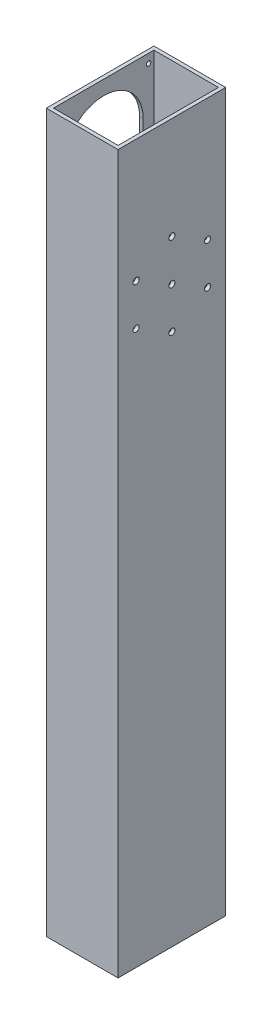
ISO-10303-21;
HEADER;
FILE_DESCRIPTION(('STEP AP214'),'2;1');
FILE_NAME('part.step','',(''),(''),'','','');
FILE_SCHEMA(('AUTOMOTIVE_DESIGN { 1 0 10303 214 1 1 1 1 }'));
ENDSEC;
DATA;
#1=APPLICATION_CONTEXT('core data for automotive mechanical design processes');
#2=APPLICATION_PROTOCOL_DEFINITION('international standard','automotive_design',2000,#1);
#3=PRODUCT_CONTEXT('',#1,'mechanical');
#4=PRODUCT('Part','Part','',(#3));
#5=PRODUCT_RELATED_PRODUCT_CATEGORY('part','',(#4));
#6=PRODUCT_DEFINITION_FORMATION('','',#4);
#7=PRODUCT_DEFINITION_CONTEXT('part definition',#1,'design');
#8=PRODUCT_DEFINITION('design','',#6,#7);
#9=PRODUCT_DEFINITION_SHAPE('','',#8);
#10=(LENGTH_UNIT() NAMED_UNIT(*) SI_UNIT(.MILLI.,.METRE.));
#11=(NAMED_UNIT(*) PLANE_ANGLE_UNIT() SI_UNIT($,.RADIAN.));
#12=(NAMED_UNIT(*) SI_UNIT($,.STERADIAN.) SOLID_ANGLE_UNIT());
#13=UNCERTAINTY_MEASURE_WITH_UNIT(LENGTH_MEASURE(1.E-05),#10,'distance_accuracy_value','');
#14=(GEOMETRIC_REPRESENTATION_CONTEXT(3) GLOBAL_UNCERTAINTY_ASSIGNED_CONTEXT((#13)) GLOBAL_UNIT_ASSIGNED_CONTEXT((#10,
#11,#12)) REPRESENTATION_CONTEXT('',''));
#15=CARTESIAN_POINT('',(0.,0.,0.));
#16=DIRECTION('',(0.,0.,1.));
#17=DIRECTION('',(1.,0.,0.));
#18=AXIS2_PLACEMENT_3D('',#15,#16,#17);
#19=CARTESIAN_POINT('',(0.,400.,0.));
#20=DIRECTION('',(1.,0.,0.));
#21=DIRECTION('',(0.,0.,-1.));
#22=AXIS2_PLACEMENT_3D('',#19,#20,#21);
#23=PLANE('',#22);
#24=CARTESIAN_POINT('',(0.,245.,-5.00000000000005));
#25=DIRECTION('',(-1.,0.,0.));
#26=DIRECTION('',(0.,0.,1.));
#27=AXIS2_PLACEMENT_3D('',#24,#25,#26);
#28=CIRCLE('',#27,1.5);
#29=CARTESIAN_POINT('',(0.,245.,-3.50000000000004));
#30=VERTEX_POINT('',#29);
#31=EDGE_CURVE('E331',#30,#30,#28,.T.);
#32=ORIENTED_EDGE('',*,*,#31,.F.);
#33=EDGE_LOOP('',(#32));
#34=FACE_BOUND('',#33,.T.);
#35=DIRECTION('',(0.,1.,0.));
#36=VECTOR('',#35,1.);
#37=CARTESIAN_POINT('',(0.,270.,-8.));
#38=LINE('',#37,#36);
#39=CARTESIAN_POINT('',(0.,270.,-8.));
#40=VERTEX_POINT('',#39);
#41=CARTESIAN_POINT('',(0.,370.,-8.00000000000002));
#42=VERTEX_POINT('',#41);
#43=EDGE_CURVE('E145',#40,#42,#38,.T.);
#44=ORIENTED_EDGE('',*,*,#43,.F.);
#45=CARTESIAN_POINT('',(0.,270.,-30.));
#46=DIRECTION('',(-1.,0.,0.));
#47=DIRECTION('',(0.,0.,1.));
#48=AXIS2_PLACEMENT_3D('',#45,#46,#47);
#49=CIRCLE('',#48,22.);
#50=CARTESIAN_POINT('',(0.,270.,-52.));
#51=VERTEX_POINT('',#50);
#52=EDGE_CURVE('E59',#51,#40,#49,.T.);
#53=ORIENTED_EDGE('',*,*,#52,.F.);
#54=DIRECTION('',(0.,-1.,0.));
#55=VECTOR('',#54,1.);
#56=CARTESIAN_POINT('',(0.,270.,-52.));
#57=LINE('',#56,#55);
#58=CARTESIAN_POINT('',(0.,370.,-52.));
#59=VERTEX_POINT('',#58);
#60=EDGE_CURVE('E152',#59,#51,#57,.T.);
#61=ORIENTED_EDGE('',*,*,#60,.F.);
#62=CARTESIAN_POINT('',(0.,370.,-30.));
#63=DIRECTION('',(-1.,0.,0.));
#64=DIRECTION('',(0.,0.,1.));
#65=AXIS2_PLACEMENT_3D('',#62,#63,#64);
#66=CIRCLE('',#65,22.);
#67=EDGE_CURVE('E135',#42,#59,#66,.T.);
#68=ORIENTED_EDGE('',*,*,#67,.F.);
#69=EDGE_LOOP('',(#44,#53,#61,#68));
#70=FACE_BOUND('',#69,.T.);
#71=DIRECTION('',(0.,0.,1.));
#72=VECTOR('',#71,1.);
#73=CARTESIAN_POINT('',(0.,0.,0.));
#74=LINE('',#73,#72);
#75=CARTESIAN_POINT('',(0.,0.,-60.));
#76=VERTEX_POINT('',#75);
#77=CARTESIAN_POINT('',(0.,0.,0.));
#78=VERTEX_POINT('',#77);
#79=EDGE_CURVE('E262',#76,#78,#74,.T.);
#80=ORIENTED_EDGE('',*,*,#79,.T.);
#81=DIRECTION('',(0.,-1.,0.));
#82=VECTOR('',#81,1.);
#83=CARTESIAN_POINT('',(0.,400.,0.));
#84=LINE('',#83,#82);
#85=CARTESIAN_POINT('',(0.,400.,0.));
#86=VERTEX_POINT('',#85);
#87=EDGE_CURVE('E300',#86,#78,#84,.T.);
#88=ORIENTED_EDGE('',*,*,#87,.F.);
#89=DIRECTION('',(0.,0.,1.));
#90=VECTOR('',#89,1.);
#91=CARTESIAN_POINT('',(0.,400.,0.));
#92=LINE('',#91,#90);
#93=CARTESIAN_POINT('',(0.,400.,-60.));
#94=VERTEX_POINT('',#93);
#95=EDGE_CURVE('E263',#94,#86,#92,.T.);
#96=ORIENTED_EDGE('',*,*,#95,.F.);
#97=DIRECTION('',(0.,-1.,0.));
#98=VECTOR('',#97,1.);
#99=CARTESIAN_POINT('',(0.,400.,-60.));
#100=LINE('',#99,#98);
#101=EDGE_CURVE('E277',#94,#76,#100,.T.);
#102=ORIENTED_EDGE('',*,*,#101,.T.);
#103=EDGE_LOOP('',(#80,#88,#96,#102));
#104=FACE_BOUND('',#103,.T.);
#105=CARTESIAN_POINT('',(0.,295.,-5.00000000000004));
#106=DIRECTION('',(-1.,0.,0.));
#107=DIRECTION('',(0.,0.,1.));
#108=AXIS2_PLACEMENT_3D('',#105,#106,#107);
#109=CIRCLE('',#108,1.5);
#110=CARTESIAN_POINT('',(0.,295.,-3.50000000000004));
#111=VERTEX_POINT('',#110);
#112=EDGE_CURVE('E343',#111,#111,#109,.T.);
#113=ORIENTED_EDGE('',*,*,#112,.F.);
#114=EDGE_LOOP('',(#113));
#115=FACE_BOUND('',#114,.T.);
#116=CARTESIAN_POINT('',(0.,345.,-5.00000000000003));
#117=DIRECTION('',(-1.,0.,0.));
#118=DIRECTION('',(0.,0.,1.));
#119=AXIS2_PLACEMENT_3D('',#116,#117,#118);
#120=CIRCLE('',#119,1.5);
#121=CARTESIAN_POINT('',(0.,345.,-3.50000000000003));
#122=VERTEX_POINT('',#121);
#123=EDGE_CURVE('E355',#122,#122,#120,.T.);
#124=ORIENTED_EDGE('',*,*,#123,.F.);
#125=EDGE_LOOP('',(#124));
#126=FACE_BOUND('',#125,.T.);
#127=CARTESIAN_POINT('',(0.,395.,-5.00000000000002));
#128=DIRECTION('',(-1.,0.,0.));
#129=DIRECTION('',(0.,0.,1.));
#130=AXIS2_PLACEMENT_3D('',#127,#128,#129);
#131=CIRCLE('',#130,1.5);
#132=CARTESIAN_POINT('',(0.,395.,-3.50000000000002));
#133=VERTEX_POINT('',#132);
#134=EDGE_CURVE('E367',#133,#133,#131,.T.);
#135=ORIENTED_EDGE('',*,*,#134,.F.);
#136=EDGE_LOOP('',(#135));
#137=FACE_BOUND('',#136,.T.);
#138=CARTESIAN_POINT('',(0.,295.,-55.));
#139=DIRECTION('',(-1.,0.,0.));
#140=DIRECTION('',(0.,0.,1.));
#141=AXIS2_PLACEMENT_3D('',#138,#139,#140);
#142=CIRCLE('',#141,1.5);
#143=CARTESIAN_POINT('',(0.,295.,-53.5));
#144=VERTEX_POINT('',#143);
#145=EDGE_CURVE('E379',#144,#144,#142,.T.);
#146=ORIENTED_EDGE('',*,*,#145,.F.);
#147=EDGE_LOOP('',(#146));
#148=FACE_BOUND('',#147,.T.);
#149=CARTESIAN_POINT('',(0.,345.,-55.));
#150=DIRECTION('',(-1.,0.,0.));
#151=DIRECTION('',(0.,0.,1.));
#152=AXIS2_PLACEMENT_3D('',#149,#150,#151);
#153=CIRCLE('',#152,1.5);
#154=CARTESIAN_POINT('',(0.,345.,-53.5));
#155=VERTEX_POINT('',#154);
#156=EDGE_CURVE('E391',#155,#155,#153,.T.);
#157=ORIENTED_EDGE('',*,*,#156,.F.);
#158=EDGE_LOOP('',(#157));
#159=FACE_BOUND('',#158,.T.);
#160=CARTESIAN_POINT('',(0.,245.,-55.));
#161=DIRECTION('',(-1.,0.,0.));
#162=DIRECTION('',(0.,0.,1.));
#163=AXIS2_PLACEMENT_3D('',#160,#161,#162);
#164=CIRCLE('',#163,1.5);
#165=CARTESIAN_POINT('',(0.,245.,-53.5));
#166=VERTEX_POINT('',#165);
#167=EDGE_CURVE('E403',#166,#166,#164,.T.);
#168=ORIENTED_EDGE('',*,*,#167,.F.);
#169=EDGE_LOOP('',(#168));
#170=FACE_BOUND('',#169,.T.);
#171=CARTESIAN_POINT('',(0.,395.,-55.));
#172=DIRECTION('',(-1.,0.,0.));
#173=DIRECTION('',(0.,0.,1.));
#174=AXIS2_PLACEMENT_3D('',#171,#172,#173);
#175=CIRCLE('',#174,1.5);
#176=CARTESIAN_POINT('',(0.,395.,-53.5));
#177=VERTEX_POINT('',#176);
#178=EDGE_CURVE('E415',#177,#177,#175,.T.);
#179=ORIENTED_EDGE('',*,*,#178,.F.);
#180=EDGE_LOOP('',(#179));
#181=FACE_BOUND('',#180,.T.);
#182=ADVANCED_FACE('F44',(#34,#70,#104,#115,#126,#137,#148,#159,#170,#181),#23,.F.);
#183=CARTESIAN_POINT('',(0.,400.,0.));
#184=DIRECTION('',(0.,-1.,0.));
#185=DIRECTION('',(0.,0.,-1.));
#186=AXIS2_PLACEMENT_3D('',#183,#184,#185);
#187=PLANE('',#186);
#188=ORIENTED_EDGE('',*,*,#95,.T.);
#189=DIRECTION('',(1.,0.,0.));
#190=VECTOR('',#189,1.);
#191=CARTESIAN_POINT('',(0.,400.,0.));
#192=LINE('',#191,#190);
#193=CARTESIAN_POINT('',(40.,400.,0.));
#194=VERTEX_POINT('',#193);
#195=EDGE_CURVE('E267',#86,#194,#192,.T.);
#196=ORIENTED_EDGE('',*,*,#195,.T.);
#197=DIRECTION('',(0.,0.,-1.));
#198=VECTOR('',#197,1.);
#199=CARTESIAN_POINT('',(40.,400.,0.));
#200=LINE('',#199,#198);
#201=CARTESIAN_POINT('',(40.,400.,-60.));
#202=VERTEX_POINT('',#201);
#203=EDGE_CURVE('E271',#194,#202,#200,.T.);
#204=ORIENTED_EDGE('',*,*,#203,.T.);
#205=DIRECTION('',(-1.,0.,0.));
#206=VECTOR('',#205,1.);
#207=CARTESIAN_POINT('',(0.,400.,-60.));
#208=LINE('',#207,#206);
#209=EDGE_CURVE('E274',#202,#94,#208,.T.);
#210=ORIENTED_EDGE('',*,*,#209,.T.);
#211=EDGE_LOOP('',(#188,#196,#204,#210));
#212=FACE_BOUND('',#211,.T.);
#213=DIRECTION('',(1.,0.,0.));
#214=VECTOR('',#213,1.);
#215=CARTESIAN_POINT('',(2.,400.,-2.));
#216=LINE('',#215,#214);
#217=CARTESIAN_POINT('',(2.,400.,-2.));
#218=VERTEX_POINT('',#217);
#219=CARTESIAN_POINT('',(38.,400.,-2.));
#220=VERTEX_POINT('',#219);
#221=EDGE_CURVE('E219',#218,#220,#216,.T.);
#222=ORIENTED_EDGE('',*,*,#221,.F.);
#223=DIRECTION('',(0.,0.,1.));
#224=VECTOR('',#223,1.);
#225=CARTESIAN_POINT('',(2.,400.,-2.));
#226=LINE('',#225,#224);
#227=CARTESIAN_POINT('',(2.,400.,-58.));
#228=VERTEX_POINT('',#227);
#229=EDGE_CURVE('E230',#228,#218,#226,.T.);
#230=ORIENTED_EDGE('',*,*,#229,.F.);
#231=DIRECTION('',(-1.,0.,0.));
#232=VECTOR('',#231,1.);
#233=CARTESIAN_POINT('',(2.,400.,-58.));
#234=LINE('',#233,#232);
#235=CARTESIAN_POINT('',(38.,400.,-58.));
#236=VERTEX_POINT('',#235);
#237=EDGE_CURVE('E226',#236,#228,#234,.T.);
#238=ORIENTED_EDGE('',*,*,#237,.F.);
#239=DIRECTION('',(0.,0.,-1.));
#240=VECTOR('',#239,1.);
#241=CARTESIAN_POINT('',(38.,400.,-2.));
#242=LINE('',#241,#240);
#243=EDGE_CURVE('E222',#220,#236,#242,.T.);
#244=ORIENTED_EDGE('',*,*,#243,.F.);
#245=EDGE_LOOP('',(#222,#230,#238,#244));
#246=FACE_BOUND('',#245,.T.);
#247=ADVANCED_FACE('F423',(#212,#246),#187,.F.);
#248=CARTESIAN_POINT('',(0.,0.,0.));
#249=DIRECTION('',(0.,-1.,0.));
#250=DIRECTION('',(0.,0.,-1.));
#251=AXIS2_PLACEMENT_3D('',#248,#249,#250);
#252=PLANE('',#251);
#253=ORIENTED_EDGE('',*,*,#79,.F.);
#254=DIRECTION('',(-1.,0.,0.));
#255=VECTOR('',#254,1.);
#256=CARTESIAN_POINT('',(0.,0.,-60.));
#257=LINE('',#256,#255);
#258=CARTESIAN_POINT('',(40.,0.,-60.));
#259=VERTEX_POINT('',#258);
#260=EDGE_CURVE('E268',#259,#76,#257,.T.);
#261=ORIENTED_EDGE('',*,*,#260,.F.);
#262=DIRECTION('',(0.,0.,-1.));
#263=VECTOR('',#262,1.);
#264=CARTESIAN_POINT('',(40.,0.,0.));
#265=LINE('',#264,#263);
#266=CARTESIAN_POINT('',(40.,0.,0.));
#267=VERTEX_POINT('',#266);
#268=EDGE_CURVE('E284',#267,#259,#265,.T.);
#269=ORIENTED_EDGE('',*,*,#268,.F.);
#270=DIRECTION('',(1.,0.,0.));
#271=VECTOR('',#270,1.);
#272=CARTESIAN_POINT('',(0.,0.,0.));
#273=LINE('',#272,#271);
#274=EDGE_CURVE('E281',#78,#267,#273,.T.);
#275=ORIENTED_EDGE('',*,*,#274,.F.);
#276=EDGE_LOOP('',(#253,#261,#269,#275));
#277=FACE_BOUND('',#276,.T.);
#278=DIRECTION('',(0.,0.,1.));
#279=VECTOR('',#278,1.);
#280=CARTESIAN_POINT('',(2.,0.,-2.));
#281=LINE('',#280,#279);
#282=CARTESIAN_POINT('',(2.,0.,-58.));
#283=VERTEX_POINT('',#282);
#284=CARTESIAN_POINT('',(2.,0.,-2.));
#285=VERTEX_POINT('',#284);
#286=EDGE_CURVE('E223',#283,#285,#281,.T.);
#287=ORIENTED_EDGE('',*,*,#286,.T.);
#288=DIRECTION('',(1.,0.,0.));
#289=VECTOR('',#288,1.);
#290=CARTESIAN_POINT('',(2.,0.,-2.));
#291=LINE('',#290,#289);
#292=CARTESIAN_POINT('',(38.,0.,-2.));
#293=VERTEX_POINT('',#292);
#294=EDGE_CURVE('E234',#285,#293,#291,.T.);
#295=ORIENTED_EDGE('',*,*,#294,.T.);
#296=DIRECTION('',(0.,0.,-1.));
#297=VECTOR('',#296,1.);
#298=CARTESIAN_POINT('',(38.,0.,-2.));
#299=LINE('',#298,#297);
#300=CARTESIAN_POINT('',(38.,0.,-58.));
#301=VERTEX_POINT('',#300);
#302=EDGE_CURVE('E238',#293,#301,#299,.T.);
#303=ORIENTED_EDGE('',*,*,#302,.T.);
#304=DIRECTION('',(-1.,0.,0.));
#305=VECTOR('',#304,1.);
#306=CARTESIAN_POINT('',(2.,0.,-58.));
#307=LINE('',#306,#305);
#308=EDGE_CURVE('E242',#301,#283,#307,.T.);
#309=ORIENTED_EDGE('',*,*,#308,.T.);
#310=EDGE_LOOP('',(#287,#295,#303,#309));
#311=FACE_BOUND('',#310,.T.);
#312=ADVANCED_FACE('F430',(#277,#311),#252,.T.);
#313=CARTESIAN_POINT('',(0.,400.,0.));
#314=DIRECTION('',(0.,0.,-1.));
#315=DIRECTION('',(-1.,0.,0.));
#316=AXIS2_PLACEMENT_3D('',#313,#314,#315);
#317=PLANE('',#316);
#318=ORIENTED_EDGE('',*,*,#274,.T.);
#319=DIRECTION('',(0.,-1.,0.));
#320=VECTOR('',#319,1.);
#321=CARTESIAN_POINT('',(40.,400.,0.));
#322=LINE('',#321,#320);
#323=EDGE_CURVE('E296',#194,#267,#322,.T.);
#324=ORIENTED_EDGE('',*,*,#323,.F.);
#325=ORIENTED_EDGE('',*,*,#195,.F.);
#326=ORIENTED_EDGE('',*,*,#87,.T.);
#327=EDGE_LOOP('',(#318,#324,#325,#326));
#328=FACE_BOUND('',#327,.T.);
#329=ADVANCED_FACE('F505',(#328),#317,.F.);
#330=CARTESIAN_POINT('',(40.,400.,0.));
#331=DIRECTION('',(-1.,0.,0.));
#332=DIRECTION('',(0.,0.,1.));
#333=AXIS2_PLACEMENT_3D('',#330,#331,#332);
#334=PLANE('',#333);
#335=CARTESIAN_POINT('',(40.,343.,-30.));
#336=DIRECTION('',(1.,0.,0.));
#337=DIRECTION('',(0.,0.,-1.));
#338=AXIS2_PLACEMENT_3D('',#335,#336,#337);
#339=CIRCLE('',#338,1.69999999999998);
#340=CARTESIAN_POINT('',(40.,343.,-31.7));
#341=VERTEX_POINT('',#340);
#342=EDGE_CURVE('E162',#341,#341,#339,.T.);
#343=ORIENTED_EDGE('',*,*,#342,.F.);
#344=EDGE_LOOP('',(#343));
#345=FACE_BOUND('',#344,.T.);
#346=CARTESIAN_POINT('',(40.,331.5,-49.9185842870421));
#347=DIRECTION('',(1.,0.,0.));
#348=DIRECTION('',(0.,0.,-1.));
#349=AXIS2_PLACEMENT_3D('',#346,#347,#348);
#350=CIRCLE('',#349,1.69999999999998);
#351=CARTESIAN_POINT('',(40.,331.5,-51.6185842870421));
#352=VERTEX_POINT('',#351);
#353=EDGE_CURVE('E174',#352,#352,#350,.T.);
#354=ORIENTED_EDGE('',*,*,#353,.F.);
#355=EDGE_LOOP('',(#354));
#356=FACE_BOUND('',#355,.T.);
#357=CARTESIAN_POINT('',(40.,308.5,-49.9185842870421));
#358=DIRECTION('',(1.,0.,0.));
#359=DIRECTION('',(0.,0.,-1.));
#360=AXIS2_PLACEMENT_3D('',#357,#358,#359);
#361=CIRCLE('',#360,1.69999999999998);
#362=CARTESIAN_POINT('',(40.,308.5,-51.6185842870421));
#363=VERTEX_POINT('',#362);
#364=EDGE_CURVE('E182',#363,#363,#361,.T.);
#365=ORIENTED_EDGE('',*,*,#364,.F.);
#366=EDGE_LOOP('',(#365));
#367=FACE_BOUND('',#366,.T.);
#368=CARTESIAN_POINT('',(40.,297.,-30.));
#369=DIRECTION('',(1.,0.,0.));
#370=DIRECTION('',(0.,0.,-1.));
#371=AXIS2_PLACEMENT_3D('',#368,#369,#370);
#372=CIRCLE('',#371,1.69999999999998);
#373=CARTESIAN_POINT('',(40.,297.,-31.7));
#374=VERTEX_POINT('',#373);
#375=EDGE_CURVE('E190',#374,#374,#372,.T.);
#376=ORIENTED_EDGE('',*,*,#375,.F.);
#377=EDGE_LOOP('',(#376));
#378=FACE_BOUND('',#377,.T.);
#379=CARTESIAN_POINT('',(40.,308.5,-10.0814157129578));
#380=DIRECTION('',(1.,0.,0.));
#381=DIRECTION('',(0.,0.,-1.));
#382=AXIS2_PLACEMENT_3D('',#379,#380,#381);
#383=CIRCLE('',#382,1.69999999999998);
#384=CARTESIAN_POINT('',(40.,308.5,-11.7814157129578));
#385=VERTEX_POINT('',#384);
#386=EDGE_CURVE('E198',#385,#385,#383,.T.);
#387=ORIENTED_EDGE('',*,*,#386,.F.);
#388=EDGE_LOOP('',(#387));
#389=FACE_BOUND('',#388,.T.);
#390=CARTESIAN_POINT('',(40.,331.5,-10.0814157129579));
#391=DIRECTION('',(1.,0.,0.));
#392=DIRECTION('',(0.,0.,-1.));
#393=AXIS2_PLACEMENT_3D('',#390,#391,#392);
#394=CIRCLE('',#393,1.69999999999998);
#395=CARTESIAN_POINT('',(40.,331.5,-11.7814157129579));
#396=VERTEX_POINT('',#395);
#397=EDGE_CURVE('E206',#396,#396,#394,.T.);
#398=ORIENTED_EDGE('',*,*,#397,.F.);
#399=EDGE_LOOP('',(#398));
#400=FACE_BOUND('',#399,.T.);
#401=CARTESIAN_POINT('',(40.,320.,-30.));
#402=DIRECTION('',(1.,0.,0.));
#403=DIRECTION('',(0.,0.,-1.));
#404=AXIS2_PLACEMENT_3D('',#401,#402,#403);
#405=CIRCLE('',#404,1.69999999999998);
#406=CARTESIAN_POINT('',(40.,320.,-31.7));
#407=VERTEX_POINT('',#406);
#408=EDGE_CURVE('E214',#407,#407,#405,.T.);
#409=ORIENTED_EDGE('',*,*,#408,.F.);
#410=EDGE_LOOP('',(#409));
#411=FACE_BOUND('',#410,.T.);
#412=ORIENTED_EDGE('',*,*,#268,.T.);
#413=DIRECTION('',(0.,-1.,0.));
#414=VECTOR('',#413,1.);
#415=CARTESIAN_POINT('',(40.,400.,-60.));
#416=LINE('',#415,#414);
#417=EDGE_CURVE('E292',#202,#259,#416,.T.);
#418=ORIENTED_EDGE('',*,*,#417,.F.);
#419=ORIENTED_EDGE('',*,*,#203,.F.);
#420=ORIENTED_EDGE('',*,*,#323,.T.);
#421=EDGE_LOOP('',(#412,#418,#419,#420));
#422=FACE_BOUND('',#421,.T.);
#423=ADVANCED_FACE('F509',(#345,#356,#367,#378,#389,#400,#411,#422),#334,.F.);
#424=CARTESIAN_POINT('',(0.,400.,-60.));
#425=DIRECTION('',(0.,0.,1.));
#426=DIRECTION('',(1.,0.,0.));
#427=AXIS2_PLACEMENT_3D('',#424,#425,#426);
#428=PLANE('',#427);
#429=ORIENTED_EDGE('',*,*,#260,.T.);
#430=ORIENTED_EDGE('',*,*,#101,.F.);
#431=ORIENTED_EDGE('',*,*,#209,.F.);
#432=ORIENTED_EDGE('',*,*,#417,.T.);
#433=EDGE_LOOP('',(#429,#430,#431,#432));
#434=FACE_BOUND('',#433,.T.);
#435=ADVANCED_FACE('F500',(#434),#428,.F.);
#436=CARTESIAN_POINT('',(2.,400.,-2.));
#437=DIRECTION('',(0.,0.,-1.));
#438=DIRECTION('',(-1.,0.,0.));
#439=AXIS2_PLACEMENT_3D('',#436,#437,#438);
#440=PLANE('',#439);
#441=ORIENTED_EDGE('',*,*,#294,.F.);
#442=DIRECTION('',(0.,-1.,0.));
#443=VECTOR('',#442,1.);
#444=CARTESIAN_POINT('',(2.,400.,-2.));
#445=LINE('',#444,#443);
#446=EDGE_CURVE('E233',#218,#285,#445,.T.);
#447=ORIENTED_EDGE('',*,*,#446,.F.);
#448=ORIENTED_EDGE('',*,*,#221,.T.);
#449=DIRECTION('',(0.,-1.,0.));
#450=VECTOR('',#449,1.);
#451=CARTESIAN_POINT('',(38.,400.,-2.));
#452=LINE('',#451,#450);
#453=EDGE_CURVE('E258',#220,#293,#452,.T.);
#454=ORIENTED_EDGE('',*,*,#453,.T.);
#455=EDGE_LOOP('',(#441,#447,#448,#454));
#456=FACE_BOUND('',#455,.T.);
#457=ADVANCED_FACE('F497',(#456),#440,.T.);
#458=CARTESIAN_POINT('',(38.,400.,-2.));
#459=DIRECTION('',(-1.,0.,0.));
#460=DIRECTION('',(0.,0.,1.));
#461=AXIS2_PLACEMENT_3D('',#458,#459,#460);
#462=PLANE('',#461);
#463=CARTESIAN_POINT('',(38.,343.,-30.));
#464=DIRECTION('',(-1.,0.,0.));
#465=DIRECTION('',(0.,0.,1.));
#466=AXIS2_PLACEMENT_3D('',#463,#464,#465);
#467=CIRCLE('',#466,1.69999999999998);
#468=CARTESIAN_POINT('',(38.,343.,-28.3));
#469=VERTEX_POINT('',#468);
#470=EDGE_CURVE('E170',#469,#469,#467,.T.);
#471=ORIENTED_EDGE('',*,*,#470,.F.);
#472=EDGE_LOOP('',(#471));
#473=FACE_BOUND('',#472,.T.);
#474=CARTESIAN_POINT('',(38.,331.5,-49.9185842870421));
#475=DIRECTION('',(-1.,0.,0.));
#476=DIRECTION('',(0.,0.,1.));
#477=AXIS2_PLACEMENT_3D('',#474,#475,#476);
#478=CIRCLE('',#477,1.69999999999998);
#479=CARTESIAN_POINT('',(38.,331.5,-48.2185842870421));
#480=VERTEX_POINT('',#479);
#481=EDGE_CURVE('E178',#480,#480,#478,.T.);
#482=ORIENTED_EDGE('',*,*,#481,.F.);
#483=EDGE_LOOP('',(#482));
#484=FACE_BOUND('',#483,.T.);
#485=CARTESIAN_POINT('',(38.,308.5,-49.9185842870421));
#486=DIRECTION('',(-1.,0.,0.));
#487=DIRECTION('',(0.,0.,1.));
#488=AXIS2_PLACEMENT_3D('',#485,#486,#487);
#489=CIRCLE('',#488,1.69999999999998);
#490=CARTESIAN_POINT('',(38.,308.5,-48.2185842870421));
#491=VERTEX_POINT('',#490);
#492=EDGE_CURVE('E186',#491,#491,#489,.T.);
#493=ORIENTED_EDGE('',*,*,#492,.F.);
#494=EDGE_LOOP('',(#493));
#495=FACE_BOUND('',#494,.T.);
#496=CARTESIAN_POINT('',(38.,297.,-30.));
#497=DIRECTION('',(-1.,0.,0.));
#498=DIRECTION('',(0.,0.,1.));
#499=AXIS2_PLACEMENT_3D('',#496,#497,#498);
#500=CIRCLE('',#499,1.69999999999998);
#501=CARTESIAN_POINT('',(38.,297.,-28.3));
#502=VERTEX_POINT('',#501);
#503=EDGE_CURVE('E194',#502,#502,#500,.T.);
#504=ORIENTED_EDGE('',*,*,#503,.F.);
#505=EDGE_LOOP('',(#504));
#506=FACE_BOUND('',#505,.T.);
#507=CARTESIAN_POINT('',(38.,308.5,-10.0814157129578));
#508=DIRECTION('',(-1.,0.,0.));
#509=DIRECTION('',(0.,0.,1.));
#510=AXIS2_PLACEMENT_3D('',#507,#508,#509);
#511=CIRCLE('',#510,1.69999999999998);
#512=CARTESIAN_POINT('',(38.,308.5,-8.38141571295786));
#513=VERTEX_POINT('',#512);
#514=EDGE_CURVE('E202',#513,#513,#511,.T.);
#515=ORIENTED_EDGE('',*,*,#514,.F.);
#516=EDGE_LOOP('',(#515));
#517=FACE_BOUND('',#516,.T.);
#518=CARTESIAN_POINT('',(38.,331.5,-10.0814157129579));
#519=DIRECTION('',(-1.,0.,0.));
#520=DIRECTION('',(0.,0.,1.));
#521=AXIS2_PLACEMENT_3D('',#518,#519,#520);
#522=CIRCLE('',#521,1.69999999999998);
#523=CARTESIAN_POINT('',(38.,331.5,-8.38141571295792));
#524=VERTEX_POINT('',#523);
#525=EDGE_CURVE('E210',#524,#524,#522,.T.);
#526=ORIENTED_EDGE('',*,*,#525,.F.);
#527=EDGE_LOOP('',(#526));
#528=FACE_BOUND('',#527,.T.);
#529=CARTESIAN_POINT('',(38.,320.,-30.));
#530=DIRECTION('',(-1.,0.,0.));
#531=DIRECTION('',(0.,0.,1.));
#532=AXIS2_PLACEMENT_3D('',#529,#530,#531);
#533=CIRCLE('',#532,1.69999999999998);
#534=CARTESIAN_POINT('',(38.,320.,-28.3));
#535=VERTEX_POINT('',#534);
#536=EDGE_CURVE('E218',#535,#535,#533,.T.);
#537=ORIENTED_EDGE('',*,*,#536,.F.);
#538=EDGE_LOOP('',(#537));
#539=FACE_BOUND('',#538,.T.);
#540=ORIENTED_EDGE('',*,*,#302,.F.);
#541=ORIENTED_EDGE('',*,*,#453,.F.);
#542=ORIENTED_EDGE('',*,*,#243,.T.);
#543=DIRECTION('',(0.,-1.,0.));
#544=VECTOR('',#543,1.);
#545=CARTESIAN_POINT('',(38.,400.,-58.));
#546=LINE('',#545,#544);
#547=EDGE_CURVE('E255',#236,#301,#546,.T.);
#548=ORIENTED_EDGE('',*,*,#547,.T.);
#549=EDGE_LOOP('',(#540,#541,#542,#548));
#550=FACE_BOUND('',#549,.T.);
#551=ADVANCED_FACE('F493',(#473,#484,#495,#506,#517,#528,#539,#550),#462,.T.);
#552=CARTESIAN_POINT('',(2.,400.,-58.));
#553=DIRECTION('',(0.,0.,1.));
#554=DIRECTION('',(1.,0.,0.));
#555=AXIS2_PLACEMENT_3D('',#552,#553,#554);
#556=PLANE('',#555);
#557=ORIENTED_EDGE('',*,*,#308,.F.);
#558=ORIENTED_EDGE('',*,*,#547,.F.);
#559=ORIENTED_EDGE('',*,*,#237,.T.);
#560=DIRECTION('',(0.,-1.,0.));
#561=VECTOR('',#560,1.);
#562=CARTESIAN_POINT('',(2.,400.,-58.));
#563=LINE('',#562,#561);
#564=EDGE_CURVE('E252',#228,#283,#563,.T.);
#565=ORIENTED_EDGE('',*,*,#564,.T.);
#566=EDGE_LOOP('',(#557,#558,#559,#565));
#567=FACE_BOUND('',#566,.T.);
#568=ADVANCED_FACE('F489',(#567),#556,.T.);
#569=CARTESIAN_POINT('',(2.,400.,-2.));
#570=DIRECTION('',(1.,0.,0.));
#571=DIRECTION('',(0.,0.,-1.));
#572=AXIS2_PLACEMENT_3D('',#569,#570,#571);
#573=PLANE('',#572);
#574=CARTESIAN_POINT('',(2.,395.,-55.));
#575=DIRECTION('',(1.,0.,0.));
#576=DIRECTION('',(0.,0.,-1.));
#577=AXIS2_PLACEMENT_3D('',#574,#575,#576);
#578=CIRCLE('',#577,1.24999999999997);
#579=CARTESIAN_POINT('',(2.,395.,-56.25));
#580=VERTEX_POINT('',#579);
#581=EDGE_CURVE('E407',#580,#580,#578,.T.);
#582=ORIENTED_EDGE('',*,*,#581,.F.);
#583=EDGE_LOOP('',(#582));
#584=FACE_BOUND('',#583,.T.);
#585=CARTESIAN_POINT('',(2.,245.,-55.));
#586=DIRECTION('',(1.,0.,0.));
#587=DIRECTION('',(0.,0.,-1.));
#588=AXIS2_PLACEMENT_3D('',#585,#586,#587);
#589=CIRCLE('',#588,1.25);
#590=CARTESIAN_POINT('',(2.,245.,-56.25));
#591=VERTEX_POINT('',#590);
#592=EDGE_CURVE('E395',#591,#591,#589,.T.);
#593=ORIENTED_EDGE('',*,*,#592,.F.);
#594=EDGE_LOOP('',(#593));
#595=FACE_BOUND('',#594,.T.);
#596=CARTESIAN_POINT('',(2.,345.,-55.));
#597=DIRECTION('',(1.,0.,0.));
#598=DIRECTION('',(0.,0.,-1.));
#599=AXIS2_PLACEMENT_3D('',#596,#597,#598);
#600=CIRCLE('',#599,1.24999999999997);
#601=CARTESIAN_POINT('',(2.,345.,-56.25));
#602=VERTEX_POINT('',#601);
#603=EDGE_CURVE('E383',#602,#602,#600,.T.);
#604=ORIENTED_EDGE('',*,*,#603,.F.);
#605=EDGE_LOOP('',(#604));
#606=FACE_BOUND('',#605,.T.);
#607=CARTESIAN_POINT('',(2.,295.,-55.));
#608=DIRECTION('',(1.,0.,0.));
#609=DIRECTION('',(0.,0.,-1.));
#610=AXIS2_PLACEMENT_3D('',#607,#608,#609);
#611=CIRCLE('',#610,1.24999999999997);
#612=CARTESIAN_POINT('',(2.,295.,-56.25));
#613=VERTEX_POINT('',#612);
#614=EDGE_CURVE('E371',#613,#613,#611,.T.);
#615=ORIENTED_EDGE('',*,*,#614,.F.);
#616=EDGE_LOOP('',(#615));
#617=FACE_BOUND('',#616,.T.);
#618=CARTESIAN_POINT('',(2.,395.,-5.00000000000002));
#619=DIRECTION('',(1.,0.,0.));
#620=DIRECTION('',(0.,0.,-1.));
#621=AXIS2_PLACEMENT_3D('',#618,#619,#620);
#622=CIRCLE('',#621,1.24999999999997);
#623=CARTESIAN_POINT('',(2.,395.,-6.25));
#624=VERTEX_POINT('',#623);
#625=EDGE_CURVE('E359',#624,#624,#622,.T.);
#626=ORIENTED_EDGE('',*,*,#625,.F.);
#627=EDGE_LOOP('',(#626));
#628=FACE_BOUND('',#627,.T.);
#629=CARTESIAN_POINT('',(2.,345.,-5.00000000000003));
#630=DIRECTION('',(1.,0.,0.));
#631=DIRECTION('',(0.,0.,-1.));
#632=AXIS2_PLACEMENT_3D('',#629,#630,#631);
#633=CIRCLE('',#632,1.24999999999997);
#634=CARTESIAN_POINT('',(2.,345.,-6.25000000000001));
#635=VERTEX_POINT('',#634);
#636=EDGE_CURVE('E347',#635,#635,#633,.T.);
#637=ORIENTED_EDGE('',*,*,#636,.F.);
#638=EDGE_LOOP('',(#637));
#639=FACE_BOUND('',#638,.T.);
#640=CARTESIAN_POINT('',(2.,295.,-5.00000000000004));
#641=DIRECTION('',(1.,0.,0.));
#642=DIRECTION('',(0.,0.,-1.));
#643=AXIS2_PLACEMENT_3D('',#640,#641,#642);
#644=CIRCLE('',#643,1.24999999999997);
#645=CARTESIAN_POINT('',(2.,295.,-6.25000000000001));
#646=VERTEX_POINT('',#645);
#647=EDGE_CURVE('E335',#646,#646,#644,.T.);
#648=ORIENTED_EDGE('',*,*,#647,.F.);
#649=EDGE_LOOP('',(#648));
#650=FACE_BOUND('',#649,.T.);
#651=CARTESIAN_POINT('',(2.,245.,-5.00000000000005));
#652=DIRECTION('',(1.,0.,0.));
#653=DIRECTION('',(0.,0.,-1.));
#654=AXIS2_PLACEMENT_3D('',#651,#652,#653);
#655=CIRCLE('',#654,1.25);
#656=CARTESIAN_POINT('',(2.,245.,-6.25000000000005));
#657=VERTEX_POINT('',#656);
#658=EDGE_CURVE('E322',#657,#657,#655,.T.);
#659=ORIENTED_EDGE('',*,*,#658,.F.);
#660=EDGE_LOOP('',(#659));
#661=FACE_BOUND('',#660,.T.);
#662=CARTESIAN_POINT('',(2.,270.,-30.));
#663=DIRECTION('',(1.,0.,0.));
#664=DIRECTION('',(0.,0.,-1.));
#665=AXIS2_PLACEMENT_3D('',#662,#663,#664);
#666=CIRCLE('',#665,22.);
#667=CARTESIAN_POINT('',(2.,270.,-8.));
#668=VERTEX_POINT('',#667);
#669=CARTESIAN_POINT('',(2.,270.,-52.));
#670=VERTEX_POINT('',#669);
#671=EDGE_CURVE('E11',#668,#670,#666,.T.);
#672=ORIENTED_EDGE('',*,*,#671,.F.);
#673=DIRECTION('',(0.,-1.,0.));
#674=VECTOR('',#673,1.);
#675=CARTESIAN_POINT('',(2.,400.,-8.00000000000002));
#676=LINE('',#675,#674);
#677=CARTESIAN_POINT('',(2.,370.,-8.00000000000002));
#678=VERTEX_POINT('',#677);
#679=EDGE_CURVE('E304',#678,#668,#676,.T.);
#680=ORIENTED_EDGE('',*,*,#679,.F.);
#681=CARTESIAN_POINT('',(2.,370.,-30.));
#682=DIRECTION('',(1.,0.,0.));
#683=DIRECTION('',(0.,0.,-1.));
#684=AXIS2_PLACEMENT_3D('',#681,#682,#683);
#685=CIRCLE('',#684,22.);
#686=CARTESIAN_POINT('',(2.,370.,-52.));
#687=VERTEX_POINT('',#686);
#688=EDGE_CURVE('E138',#687,#678,#685,.T.);
#689=ORIENTED_EDGE('',*,*,#688,.F.);
#690=DIRECTION('',(0.,1.,0.));
#691=VECTOR('',#690,1.);
#692=CARTESIAN_POINT('',(2.,400.,-52.));
#693=LINE('',#692,#691);
#694=EDGE_CURVE('E52',#670,#687,#693,.T.);
#695=ORIENTED_EDGE('',*,*,#694,.F.);
#696=EDGE_LOOP('',(#672,#680,#689,#695));
#697=FACE_BOUND('',#696,.T.);
#698=ORIENTED_EDGE('',*,*,#286,.F.);
#699=ORIENTED_EDGE('',*,*,#564,.F.);
#700=ORIENTED_EDGE('',*,*,#229,.T.);
#701=ORIENTED_EDGE('',*,*,#446,.T.);
#702=EDGE_LOOP('',(#698,#699,#700,#701));
#703=FACE_BOUND('',#702,.T.);
#704=ADVANCED_FACE('F318',(#584,#595,#606,#617,#628,#639,#650,#661,#697,#703),#573,.T.);
#705=CARTESIAN_POINT('',(40.,320.,-30.));
#706=DIRECTION('',(1.,0.,0.));
#707=DIRECTION('',(0.,0.,-1.));
#708=AXIS2_PLACEMENT_3D('',#705,#706,#707);
#709=CYLINDRICAL_SURFACE('',#708,1.69999999999998);
#710=ORIENTED_EDGE('',*,*,#536,.T.);
#711=EDGE_LOOP('',(#710));
#712=FACE_BOUND('',#711,.T.);
#713=ORIENTED_EDGE('',*,*,#408,.T.);
#714=EDGE_LOOP('',(#713));
#715=FACE_BOUND('',#714,.T.);
#716=ADVANCED_FACE('F483',(#712,#715),#709,.F.);
#717=CARTESIAN_POINT('',(40.,331.5,-10.0814157129579));
#718=DIRECTION('',(1.,0.,0.));
#719=DIRECTION('',(0.,0.,-1.));
#720=AXIS2_PLACEMENT_3D('',#717,#718,#719);
#721=CYLINDRICAL_SURFACE('',#720,1.69999999999998);
#722=ORIENTED_EDGE('',*,*,#525,.T.);
#723=EDGE_LOOP('',(#722));
#724=FACE_BOUND('',#723,.T.);
#725=ORIENTED_EDGE('',*,*,#397,.T.);
#726=EDGE_LOOP('',(#725));
#727=FACE_BOUND('',#726,.T.);
#728=ADVANCED_FACE('F479',(#724,#727),#721,.F.);
#729=CARTESIAN_POINT('',(40.,308.5,-10.0814157129578));
#730=DIRECTION('',(1.,0.,0.));
#731=DIRECTION('',(0.,0.,-1.));
#732=AXIS2_PLACEMENT_3D('',#729,#730,#731);
#733=CYLINDRICAL_SURFACE('',#732,1.69999999999998);
#734=ORIENTED_EDGE('',*,*,#514,.T.);
#735=EDGE_LOOP('',(#734));
#736=FACE_BOUND('',#735,.T.);
#737=ORIENTED_EDGE('',*,*,#386,.T.);
#738=EDGE_LOOP('',(#737));
#739=FACE_BOUND('',#738,.T.);
#740=ADVANCED_FACE('F475',(#736,#739),#733,.F.);
#741=CARTESIAN_POINT('',(40.,297.,-30.));
#742=DIRECTION('',(1.,0.,0.));
#743=DIRECTION('',(0.,0.,-1.));
#744=AXIS2_PLACEMENT_3D('',#741,#742,#743);
#745=CYLINDRICAL_SURFACE('',#744,1.69999999999998);
#746=ORIENTED_EDGE('',*,*,#503,.T.);
#747=EDGE_LOOP('',(#746));
#748=FACE_BOUND('',#747,.T.);
#749=ORIENTED_EDGE('',*,*,#375,.T.);
#750=EDGE_LOOP('',(#749));
#751=FACE_BOUND('',#750,.T.);
#752=ADVANCED_FACE('F471',(#748,#751),#745,.F.);
#753=CARTESIAN_POINT('',(40.,308.5,-49.9185842870421));
#754=DIRECTION('',(1.,0.,0.));
#755=DIRECTION('',(0.,0.,-1.));
#756=AXIS2_PLACEMENT_3D('',#753,#754,#755);
#757=CYLINDRICAL_SURFACE('',#756,1.69999999999998);
#758=ORIENTED_EDGE('',*,*,#492,.T.);
#759=EDGE_LOOP('',(#758));
#760=FACE_BOUND('',#759,.T.);
#761=ORIENTED_EDGE('',*,*,#364,.T.);
#762=EDGE_LOOP('',(#761));
#763=FACE_BOUND('',#762,.T.);
#764=ADVANCED_FACE('F467',(#760,#763),#757,.F.);
#765=CARTESIAN_POINT('',(40.,331.5,-49.9185842870421));
#766=DIRECTION('',(1.,0.,0.));
#767=DIRECTION('',(0.,0.,-1.));
#768=AXIS2_PLACEMENT_3D('',#765,#766,#767);
#769=CYLINDRICAL_SURFACE('',#768,1.69999999999998);
#770=ORIENTED_EDGE('',*,*,#481,.T.);
#771=EDGE_LOOP('',(#770));
#772=FACE_BOUND('',#771,.T.);
#773=ORIENTED_EDGE('',*,*,#353,.T.);
#774=EDGE_LOOP('',(#773));
#775=FACE_BOUND('',#774,.T.);
#776=ADVANCED_FACE('F463',(#772,#775),#769,.F.);
#777=CARTESIAN_POINT('',(40.,343.,-30.));
#778=DIRECTION('',(1.,0.,0.));
#779=DIRECTION('',(0.,0.,-1.));
#780=AXIS2_PLACEMENT_3D('',#777,#778,#779);
#781=CYLINDRICAL_SURFACE('',#780,1.69999999999998);
#782=ORIENTED_EDGE('',*,*,#470,.T.);
#783=EDGE_LOOP('',(#782));
#784=FACE_BOUND('',#783,.T.);
#785=ORIENTED_EDGE('',*,*,#342,.T.);
#786=EDGE_LOOP('',(#785));
#787=FACE_BOUND('',#786,.T.);
#788=ADVANCED_FACE('F460',(#784,#787),#781,.F.);
#789=CARTESIAN_POINT('',(3.,270.,-30.));
#790=DIRECTION('',(-1.,0.,0.));
#791=DIRECTION('',(0.,0.,1.));
#792=AXIS2_PLACEMENT_3D('',#789,#790,#791);
#793=CYLINDRICAL_SURFACE('',#792,22.);
#794=ORIENTED_EDGE('',*,*,#671,.T.);
#795=DIRECTION('',(-1.,0.,0.));
#796=VECTOR('',#795,1.);
#797=CARTESIAN_POINT('',(3.,270.,-52.));
#798=LINE('',#797,#796);
#799=EDGE_CURVE('E159',#670,#51,#798,.T.);
#800=ORIENTED_EDGE('',*,*,#799,.T.);
#801=ORIENTED_EDGE('',*,*,#52,.T.);
#802=DIRECTION('',(-1.,0.,0.));
#803=VECTOR('',#802,1.);
#804=CARTESIAN_POINT('',(3.,270.,-8.));
#805=LINE('',#804,#803);
#806=EDGE_CURVE('E142',#668,#40,#805,.T.);
#807=ORIENTED_EDGE('',*,*,#806,.F.);
#808=EDGE_LOOP('',(#794,#800,#801,#807));
#809=FACE_BOUND('',#808,.T.);
#810=ADVANCED_FACE('F320',(#809),#793,.F.);
#811=CARTESIAN_POINT('',(3.,270.,-52.));
#812=DIRECTION('',(0.,0.,-1.));
#813=DIRECTION('',(0.,1.,0.));
#814=AXIS2_PLACEMENT_3D('',#811,#812,#813);
#815=PLANE('',#814);
#816=ORIENTED_EDGE('',*,*,#694,.T.);
#817=DIRECTION('',(-1.,0.,0.));
#818=VECTOR('',#817,1.);
#819=CARTESIAN_POINT('',(3.,370.,-52.));
#820=LINE('',#819,#818);
#821=EDGE_CURVE('E141',#687,#59,#820,.T.);
#822=ORIENTED_EDGE('',*,*,#821,.T.);
#823=ORIENTED_EDGE('',*,*,#60,.T.);
#824=ORIENTED_EDGE('',*,*,#799,.F.);
#825=EDGE_LOOP('',(#816,#822,#823,#824));
#826=FACE_BOUND('',#825,.T.);
#827=ADVANCED_FACE('F315',(#826),#815,.F.);
#828=CARTESIAN_POINT('',(3.,370.,-30.));
#829=DIRECTION('',(-1.,0.,0.));
#830=DIRECTION('',(0.,0.,1.));
#831=AXIS2_PLACEMENT_3D('',#828,#829,#830);
#832=CYLINDRICAL_SURFACE('',#831,22.);
#833=ORIENTED_EDGE('',*,*,#688,.T.);
#834=DIRECTION('',(-1.,0.,0.));
#835=VECTOR('',#834,1.);
#836=CARTESIAN_POINT('',(3.,370.,-8.00000000000002));
#837=LINE('',#836,#835);
#838=EDGE_CURVE('E67',#678,#42,#837,.T.);
#839=ORIENTED_EDGE('',*,*,#838,.T.);
#840=ORIENTED_EDGE('',*,*,#67,.T.);
#841=ORIENTED_EDGE('',*,*,#821,.F.);
#842=EDGE_LOOP('',(#833,#839,#840,#841));
#843=FACE_BOUND('',#842,.T.);
#844=ADVANCED_FACE('F132',(#843),#832,.F.);
#845=CARTESIAN_POINT('',(3.,270.,-8.));
#846=DIRECTION('',(0.,0.,1.));
#847=DIRECTION('',(0.,-1.,0.));
#848=AXIS2_PLACEMENT_3D('',#845,#846,#847);
#849=PLANE('',#848);
#850=ORIENTED_EDGE('',*,*,#679,.T.);
#851=ORIENTED_EDGE('',*,*,#806,.T.);
#852=ORIENTED_EDGE('',*,*,#43,.T.);
#853=ORIENTED_EDGE('',*,*,#838,.F.);
#854=EDGE_LOOP('',(#850,#851,#852,#853));
#855=FACE_BOUND('',#854,.T.);
#856=ADVANCED_FACE('F146',(#855),#849,.F.);
#857=CARTESIAN_POINT('',(0.,245.,-5.00000000000005));
#858=DIRECTION('',(-1.,0.,0.));
#859=DIRECTION('',(0.,0.,1.));
#860=AXIS2_PLACEMENT_3D('',#857,#858,#859);
#861=CYLINDRICAL_SURFACE('',#860,1.25);
#862=CARTESIAN_POINT('',(0.250000000000007,245.,-5.00000000000005));
#863=DIRECTION('',(-1.,0.,0.));
#864=DIRECTION('',(0.,0.,1.));
#865=AXIS2_PLACEMENT_3D('',#862,#863,#864);
#866=CIRCLE('',#865,1.25);
#867=CARTESIAN_POINT('',(0.250000000000007,245.,-3.75000000000004));
#868=VERTEX_POINT('',#867);
#869=EDGE_CURVE('E325',#868,#868,#866,.T.);
#870=ORIENTED_EDGE('',*,*,#869,.T.);
#871=EDGE_LOOP('',(#870));
#872=FACE_BOUND('',#871,.T.);
#873=ORIENTED_EDGE('',*,*,#658,.T.);
#874=EDGE_LOOP('',(#873));
#875=FACE_BOUND('',#874,.T.);
#876=ADVANCED_FACE('F438',(#872,#875),#861,.F.);
#877=CARTESIAN_POINT('',(0.,245.,-5.00000000000005));
#878=DIRECTION('',(-1.,0.,0.));
#879=DIRECTION('',(0.,0.,1.));
#880=AXIS2_PLACEMENT_3D('',#877,#878,#879);
#881=CONICAL_SURFACE('',#880,1.5,0.785398163397434);
#882=ORIENTED_EDGE('',*,*,#869,.F.);
#883=EDGE_LOOP('',(#882));
#884=FACE_BOUND('',#883,.T.);
#885=ORIENTED_EDGE('',*,*,#31,.T.);
#886=EDGE_LOOP('',(#885));
#887=FACE_BOUND('',#886,.T.);
#888=ADVANCED_FACE('F435',(#884,#887),#881,.F.);
#889=CARTESIAN_POINT('',(0.,295.,-5.00000000000004));
#890=DIRECTION('',(-1.,0.,0.));
#891=DIRECTION('',(0.,0.,1.));
#892=AXIS2_PLACEMENT_3D('',#889,#890,#891);
#893=CYLINDRICAL_SURFACE('',#892,1.24999999999997);
#894=CARTESIAN_POINT('',(0.250000000000007,295.,-5.00000000000004));
#895=DIRECTION('',(-1.,0.,0.));
#896=DIRECTION('',(0.,0.,1.));
#897=AXIS2_PLACEMENT_3D('',#894,#895,#896);
#898=CIRCLE('',#897,1.24999999999997);
#899=CARTESIAN_POINT('',(0.250000000000007,295.,-3.75000000000007));
#900=VERTEX_POINT('',#899);
#901=EDGE_CURVE('E339',#900,#900,#898,.T.);
#902=ORIENTED_EDGE('',*,*,#901,.T.);
#903=EDGE_LOOP('',(#902));
#904=FACE_BOUND('',#903,.T.);
#905=ORIENTED_EDGE('',*,*,#647,.T.);
#906=EDGE_LOOP('',(#905));
#907=FACE_BOUND('',#906,.T.);
#908=ADVANCED_FACE('F437',(#904,#907),#893,.F.);
#909=CARTESIAN_POINT('',(0.,295.,-5.00000000000004));
#910=DIRECTION('',(-1.,0.,0.));
#911=DIRECTION('',(0.,0.,1.));
#912=AXIS2_PLACEMENT_3D('',#909,#910,#911);
#913=CONICAL_SURFACE('',#912,1.5,0.78539816339749);
#914=ORIENTED_EDGE('',*,*,#901,.F.);
#915=EDGE_LOOP('',(#914));
#916=FACE_BOUND('',#915,.T.);
#917=ORIENTED_EDGE('',*,*,#112,.T.);
#918=EDGE_LOOP('',(#917));
#919=FACE_BOUND('',#918,.T.);
#920=ADVANCED_FACE('F445',(#916,#919),#913,.F.);
#921=CARTESIAN_POINT('',(0.,345.,-5.00000000000003));
#922=DIRECTION('',(-1.,0.,0.));
#923=DIRECTION('',(0.,0.,1.));
#924=AXIS2_PLACEMENT_3D('',#921,#922,#923);
#925=CYLINDRICAL_SURFACE('',#924,1.24999999999997);
#926=CARTESIAN_POINT('',(0.250000000000007,345.,-5.00000000000003));
#927=DIRECTION('',(-1.,0.,0.));
#928=DIRECTION('',(0.,0.,1.));
#929=AXIS2_PLACEMENT_3D('',#926,#927,#928);
#930=CIRCLE('',#929,1.24999999999997);
#931=CARTESIAN_POINT('',(0.250000000000007,345.,-3.75000000000006));
#932=VERTEX_POINT('',#931);
#933=EDGE_CURVE('E351',#932,#932,#930,.T.);
#934=ORIENTED_EDGE('',*,*,#933,.T.);
#935=EDGE_LOOP('',(#934));
#936=FACE_BOUND('',#935,.T.);
#937=ORIENTED_EDGE('',*,*,#636,.T.);
#938=EDGE_LOOP('',(#937));
#939=FACE_BOUND('',#938,.T.);
#940=ADVANCED_FACE('F597',(#936,#939),#925,.F.);
#941=CARTESIAN_POINT('',(0.,345.,-5.00000000000003));
#942=DIRECTION('',(-1.,0.,0.));
#943=DIRECTION('',(0.,0.,1.));
#944=AXIS2_PLACEMENT_3D('',#941,#942,#943);
#945=CONICAL_SURFACE('',#944,1.5,0.78539816339749);
#946=ORIENTED_EDGE('',*,*,#933,.F.);
#947=EDGE_LOOP('',(#946));
#948=FACE_BOUND('',#947,.T.);
#949=ORIENTED_EDGE('',*,*,#123,.T.);
#950=EDGE_LOOP('',(#949));
#951=FACE_BOUND('',#950,.T.);
#952=ADVANCED_FACE('F593',(#948,#951),#945,.F.);
#953=CARTESIAN_POINT('',(0.,395.,-5.00000000000002));
#954=DIRECTION('',(-1.,0.,0.));
#955=DIRECTION('',(0.,0.,1.));
#956=AXIS2_PLACEMENT_3D('',#953,#954,#955);
#957=CYLINDRICAL_SURFACE('',#956,1.24999999999997);
#958=CARTESIAN_POINT('',(0.250000000000007,395.,-5.00000000000002));
#959=DIRECTION('',(-1.,0.,0.));
#960=DIRECTION('',(0.,0.,1.));
#961=AXIS2_PLACEMENT_3D('',#958,#959,#960);
#962=CIRCLE('',#961,1.24999999999997);
#963=CARTESIAN_POINT('',(0.250000000000007,395.,-3.75000000000005));
#964=VERTEX_POINT('',#963);
#965=EDGE_CURVE('E363',#964,#964,#962,.T.);
#966=ORIENTED_EDGE('',*,*,#965,.T.);
#967=EDGE_LOOP('',(#966));
#968=FACE_BOUND('',#967,.T.);
#969=ORIENTED_EDGE('',*,*,#625,.T.);
#970=EDGE_LOOP('',(#969));
#971=FACE_BOUND('',#970,.T.);
#972=ADVANCED_FACE('F589',(#968,#971),#957,.F.);
#973=CARTESIAN_POINT('',(0.,395.,-5.00000000000002));
#974=DIRECTION('',(-1.,0.,0.));
#975=DIRECTION('',(0.,0.,1.));
#976=AXIS2_PLACEMENT_3D('',#973,#974,#975);
#977=CONICAL_SURFACE('',#976,1.5,0.78539816339749);
#978=ORIENTED_EDGE('',*,*,#965,.F.);
#979=EDGE_LOOP('',(#978));
#980=FACE_BOUND('',#979,.T.);
#981=ORIENTED_EDGE('',*,*,#134,.T.);
#982=EDGE_LOOP('',(#981));
#983=FACE_BOUND('',#982,.T.);
#984=ADVANCED_FACE('F585',(#980,#983),#977,.F.);
#985=CARTESIAN_POINT('',(0.,295.,-55.));
#986=DIRECTION('',(-1.,0.,0.));
#987=DIRECTION('',(0.,0.,1.));
#988=AXIS2_PLACEMENT_3D('',#985,#986,#987);
#989=CYLINDRICAL_SURFACE('',#988,1.24999999999997);
#990=CARTESIAN_POINT('',(0.250000000000007,295.,-55.));
#991=DIRECTION('',(-1.,0.,0.));
#992=DIRECTION('',(0.,0.,1.));
#993=AXIS2_PLACEMENT_3D('',#990,#991,#992);
#994=CIRCLE('',#993,1.24999999999997);
#995=CARTESIAN_POINT('',(0.250000000000007,295.,-53.75));
#996=VERTEX_POINT('',#995);
#997=EDGE_CURVE('E375',#996,#996,#994,.T.);
#998=ORIENTED_EDGE('',*,*,#997,.T.);
#999=EDGE_LOOP('',(#998));
#1000=FACE_BOUND('',#999,.T.);
#1001=ORIENTED_EDGE('',*,*,#614,.T.);
#1002=EDGE_LOOP('',(#1001));
#1003=FACE_BOUND('',#1002,.T.);
#1004=ADVANCED_FACE('F581',(#1000,#1003),#989,.F.);
#1005=CARTESIAN_POINT('',(0.,295.,-55.));
#1006=DIRECTION('',(-1.,0.,0.));
#1007=DIRECTION('',(0.,0.,1.));
#1008=AXIS2_PLACEMENT_3D('',#1005,#1006,#1007);
#1009=CONICAL_SURFACE('',#1008,1.5,0.78539816339749);
#1010=ORIENTED_EDGE('',*,*,#997,.F.);
#1011=EDGE_LOOP('',(#1010));
#1012=FACE_BOUND('',#1011,.T.);
#1013=ORIENTED_EDGE('',*,*,#145,.T.);
#1014=EDGE_LOOP('',(#1013));
#1015=FACE_BOUND('',#1014,.T.);
#1016=ADVANCED_FACE('F577',(#1012,#1015),#1009,.F.);
#1017=CARTESIAN_POINT('',(0.,345.,-55.));
#1018=DIRECTION('',(-1.,0.,0.));
#1019=DIRECTION('',(0.,0.,1.));
#1020=AXIS2_PLACEMENT_3D('',#1017,#1018,#1019);
#1021=CYLINDRICAL_SURFACE('',#1020,1.24999999999997);
#1022=CARTESIAN_POINT('',(0.250000000000007,345.,-55.));
#1023=DIRECTION('',(-1.,0.,0.));
#1024=DIRECTION('',(0.,0.,1.));
#1025=AXIS2_PLACEMENT_3D('',#1022,#1023,#1024);
#1026=CIRCLE('',#1025,1.24999999999997);
#1027=CARTESIAN_POINT('',(0.250000000000007,345.,-53.75));
#1028=VERTEX_POINT('',#1027);
#1029=EDGE_CURVE('E387',#1028,#1028,#1026,.T.);
#1030=ORIENTED_EDGE('',*,*,#1029,.T.);
#1031=EDGE_LOOP('',(#1030));
#1032=FACE_BOUND('',#1031,.T.);
#1033=ORIENTED_EDGE('',*,*,#603,.T.);
#1034=EDGE_LOOP('',(#1033));
#1035=FACE_BOUND('',#1034,.T.);
#1036=ADVANCED_FACE('F573',(#1032,#1035),#1021,.F.);
#1037=CARTESIAN_POINT('',(0.,345.,-55.));
#1038=DIRECTION('',(-1.,0.,0.));
#1039=DIRECTION('',(0.,0.,1.));
#1040=AXIS2_PLACEMENT_3D('',#1037,#1038,#1039);
#1041=CONICAL_SURFACE('',#1040,1.5,0.78539816339749);
#1042=ORIENTED_EDGE('',*,*,#1029,.F.);
#1043=EDGE_LOOP('',(#1042));
#1044=FACE_BOUND('',#1043,.T.);
#1045=ORIENTED_EDGE('',*,*,#156,.T.);
#1046=EDGE_LOOP('',(#1045));
#1047=FACE_BOUND('',#1046,.T.);
#1048=ADVANCED_FACE('F565',(#1044,#1047),#1041,.F.);
#1049=CARTESIAN_POINT('',(0.,245.,-55.));
#1050=DIRECTION('',(-1.,0.,0.));
#1051=DIRECTION('',(0.,0.,1.));
#1052=AXIS2_PLACEMENT_3D('',#1049,#1050,#1051);
#1053=CYLINDRICAL_SURFACE('',#1052,1.25);
#1054=CARTESIAN_POINT('',(0.250000000000007,245.,-55.));
#1055=DIRECTION('',(-1.,0.,0.));
#1056=DIRECTION('',(0.,0.,1.));
#1057=AXIS2_PLACEMENT_3D('',#1054,#1055,#1056);
#1058=CIRCLE('',#1057,1.25);
#1059=CARTESIAN_POINT('',(0.250000000000007,245.,-53.75));
#1060=VERTEX_POINT('',#1059);
#1061=EDGE_CURVE('E399',#1060,#1060,#1058,.T.);
#1062=ORIENTED_EDGE('',*,*,#1061,.T.);
#1063=EDGE_LOOP('',(#1062));
#1064=FACE_BOUND('',#1063,.T.);
#1065=ORIENTED_EDGE('',*,*,#592,.T.);
#1066=EDGE_LOOP('',(#1065));
#1067=FACE_BOUND('',#1066,.T.);
#1068=ADVANCED_FACE('F556',(#1064,#1067),#1053,.F.);
#1069=CARTESIAN_POINT('',(0.,245.,-55.));
#1070=DIRECTION('',(-1.,0.,0.));
#1071=DIRECTION('',(0.,0.,1.));
#1072=AXIS2_PLACEMENT_3D('',#1069,#1070,#1071);
#1073=CONICAL_SURFACE('',#1072,1.5,0.785398163397434);
#1074=ORIENTED_EDGE('',*,*,#1061,.F.);
#1075=EDGE_LOOP('',(#1074));
#1076=FACE_BOUND('',#1075,.T.);
#1077=ORIENTED_EDGE('',*,*,#167,.T.);
#1078=EDGE_LOOP('',(#1077));
#1079=FACE_BOUND('',#1078,.T.);
#1080=ADVANCED_FACE('F553',(#1076,#1079),#1073,.F.);
#1081=CARTESIAN_POINT('',(0.,395.,-55.));
#1082=DIRECTION('',(-1.,0.,0.));
#1083=DIRECTION('',(0.,0.,1.));
#1084=AXIS2_PLACEMENT_3D('',#1081,#1082,#1083);
#1085=CYLINDRICAL_SURFACE('',#1084,1.24999999999997);
#1086=CARTESIAN_POINT('',(0.250000000000007,395.,-55.));
#1087=DIRECTION('',(-1.,0.,0.));
#1088=DIRECTION('',(0.,0.,1.));
#1089=AXIS2_PLACEMENT_3D('',#1086,#1087,#1088);
#1090=CIRCLE('',#1089,1.24999999999997);
#1091=CARTESIAN_POINT('',(0.250000000000007,395.,-53.75));
#1092=VERTEX_POINT('',#1091);
#1093=EDGE_CURVE('E411',#1092,#1092,#1090,.T.);
#1094=ORIENTED_EDGE('',*,*,#1093,.T.);
#1095=EDGE_LOOP('',(#1094));
#1096=FACE_BOUND('',#1095,.T.);
#1097=ORIENTED_EDGE('',*,*,#581,.T.);
#1098=EDGE_LOOP('',(#1097));
#1099=FACE_BOUND('',#1098,.T.);
#1100=ADVANCED_FACE('F555',(#1096,#1099),#1085,.F.);
#1101=CARTESIAN_POINT('',(0.,395.,-55.));
#1102=DIRECTION('',(-1.,0.,0.));
#1103=DIRECTION('',(0.,0.,1.));
#1104=AXIS2_PLACEMENT_3D('',#1101,#1102,#1103);
#1105=CONICAL_SURFACE('',#1104,1.5,0.78539816339749);
#1106=ORIENTED_EDGE('',*,*,#1093,.F.);
#1107=EDGE_LOOP('',(#1106));
#1108=FACE_BOUND('',#1107,.T.);
#1109=ORIENTED_EDGE('',*,*,#178,.T.);
#1110=EDGE_LOOP('',(#1109));
#1111=FACE_BOUND('',#1110,.T.);
#1112=ADVANCED_FACE('F420',(#1108,#1111),#1105,.F.);
#1113=CLOSED_SHELL('',(#182,#247,#312,#329,#423,#435,#457,#551,#568,#704,#716,#728,#740,#752,
#764,#776,#788,#810,#827,#844,#856,#876,#888,#908,#920,#940,#952,#972,#984,#1004,#1016,#1036,
#1048,#1068,#1080,#1100,#1112));
#1114=MANIFOLD_SOLID_BREP('B2',#1113);
#1115=ADVANCED_BREP_SHAPE_REPRESENTATION('',(#18,#1114),#14);
#1116=SHAPE_DEFINITION_REPRESENTATION(#9,#1115);
ENDSEC;
END-ISO-10303-21;
